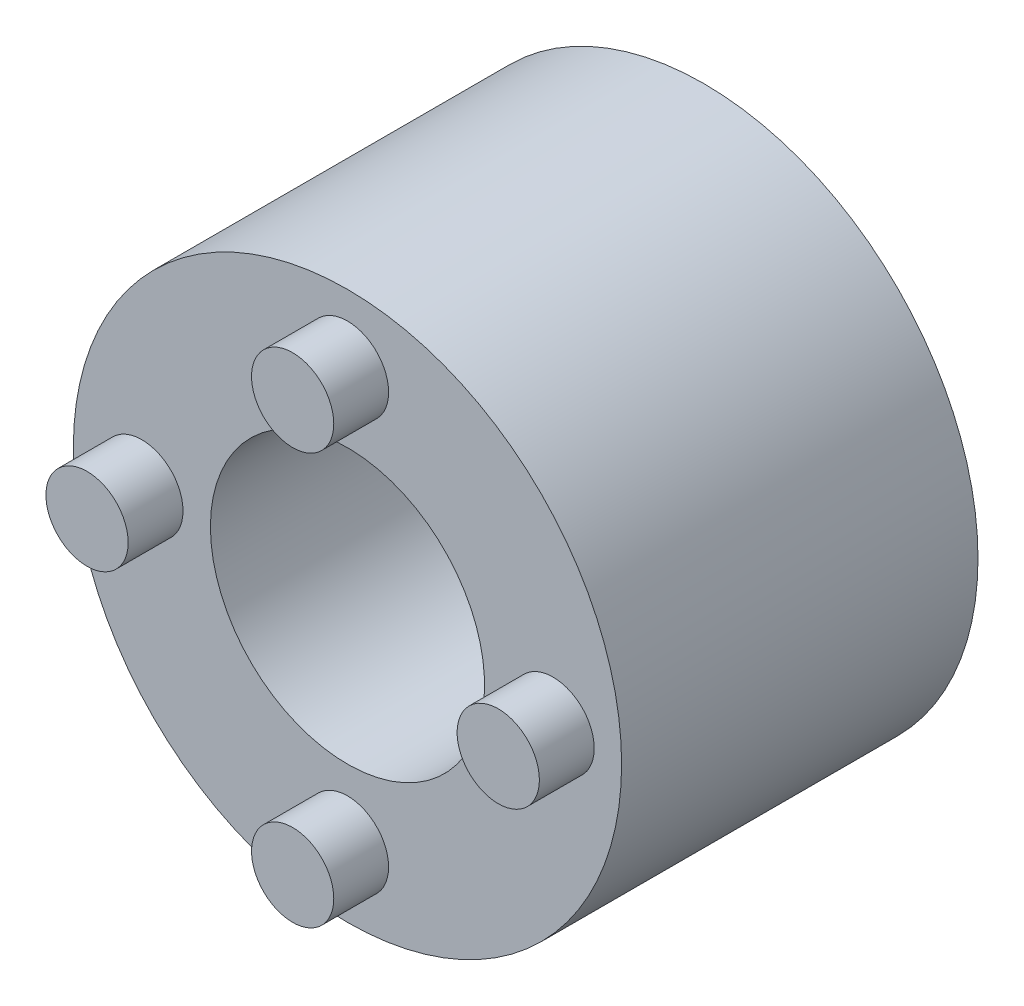
ISO-10303-21;
HEADER;
FILE_DESCRIPTION(('STEP AP214'),'2;1');
FILE_NAME('part.step','',(''),(''),'','','');
FILE_SCHEMA(('AUTOMOTIVE_DESIGN { 1 0 10303 214 1 1 1 1 }'));
ENDSEC;
DATA;
#1=APPLICATION_CONTEXT('core data for automotive mechanical design processes');
#2=APPLICATION_PROTOCOL_DEFINITION('international standard','automotive_design',2000,#1);
#3=PRODUCT_CONTEXT('',#1,'mechanical');
#4=PRODUCT('Part','Part','',(#3));
#5=PRODUCT_RELATED_PRODUCT_CATEGORY('part','',(#4));
#6=PRODUCT_DEFINITION_FORMATION('','',#4);
#7=PRODUCT_DEFINITION_CONTEXT('part definition',#1,'design');
#8=PRODUCT_DEFINITION('design','',#6,#7);
#9=PRODUCT_DEFINITION_SHAPE('','',#8);
#10=(LENGTH_UNIT() NAMED_UNIT(*) SI_UNIT(.MILLI.,.METRE.));
#11=(NAMED_UNIT(*) PLANE_ANGLE_UNIT() SI_UNIT($,.RADIAN.));
#12=(NAMED_UNIT(*) SI_UNIT($,.STERADIAN.) SOLID_ANGLE_UNIT());
#13=UNCERTAINTY_MEASURE_WITH_UNIT(LENGTH_MEASURE(1.E-05),#10,'distance_accuracy_value','');
#14=(GEOMETRIC_REPRESENTATION_CONTEXT(3) GLOBAL_UNCERTAINTY_ASSIGNED_CONTEXT((#13)) GLOBAL_UNIT_ASSIGNED_CONTEXT((#10,
#11,#12)) REPRESENTATION_CONTEXT('',''));
#15=CARTESIAN_POINT('',(0.,0.,0.));
#16=DIRECTION('',(0.,0.,1.));
#17=DIRECTION('',(1.,0.,0.));
#18=AXIS2_PLACEMENT_3D('',#15,#16,#17);
#19=CARTESIAN_POINT('',(0.,0.,6.5));
#20=DIRECTION('',(0.,0.,1.));
#21=DIRECTION('',(1.,0.,0.));
#22=AXIS2_PLACEMENT_3D('',#19,#20,#21);
#23=PLANE('',#22);
#24=CARTESIAN_POINT('',(-7.5,0.,6.5));
#25=DIRECTION('',(0.,0.,1.));
#26=DIRECTION('',(1.,0.,0.));
#27=AXIS2_PLACEMENT_3D('',#24,#25,#26);
#28=CIRCLE('',#27,1.5);
#29=CARTESIAN_POINT('',(-6.,0.,6.5));
#30=VERTEX_POINT('',#29);
#31=EDGE_CURVE('E37',#30,#30,#28,.F.);
#32=ORIENTED_EDGE('',*,*,#31,.T.);
#33=EDGE_LOOP('',(#32));
#34=FACE_BOUND('',#33,.T.);
#35=CARTESIAN_POINT('',(0.,-7.5,6.5));
#36=DIRECTION('',(0.,0.,1.));
#37=DIRECTION('',(1.,0.,0.));
#38=AXIS2_PLACEMENT_3D('',#35,#36,#37);
#39=CIRCLE('',#38,1.5);
#40=CARTESIAN_POINT('',(1.5,-7.5,6.5));
#41=VERTEX_POINT('',#40);
#42=EDGE_CURVE('E59',#41,#41,#39,.F.);
#43=ORIENTED_EDGE('',*,*,#42,.T.);
#44=EDGE_LOOP('',(#43));
#45=FACE_BOUND('',#44,.T.);
#46=CARTESIAN_POINT('',(7.5,0.,6.5));
#47=DIRECTION('',(0.,0.,1.));
#48=DIRECTION('',(1.,0.,0.));
#49=AXIS2_PLACEMENT_3D('',#46,#47,#48);
#50=CIRCLE('',#49,1.5);
#51=CARTESIAN_POINT('',(9.,0.,6.5));
#52=VERTEX_POINT('',#51);
#53=EDGE_CURVE('E56',#52,#52,#50,.F.);
#54=ORIENTED_EDGE('',*,*,#53,.T.);
#55=EDGE_LOOP('',(#54));
#56=FACE_BOUND('',#55,.T.);
#57=CARTESIAN_POINT('',(0.,7.5,6.5));
#58=DIRECTION('',(0.,0.,1.));
#59=DIRECTION('',(1.,0.,0.));
#60=AXIS2_PLACEMENT_3D('',#57,#58,#59);
#61=CIRCLE('',#60,1.5);
#62=CARTESIAN_POINT('',(1.5,7.5,6.5));
#63=VERTEX_POINT('',#62);
#64=EDGE_CURVE('E52',#63,#63,#61,.F.);
#65=ORIENTED_EDGE('',*,*,#64,.T.);
#66=EDGE_LOOP('',(#65));
#67=FACE_BOUND('',#66,.T.);
#68=CARTESIAN_POINT('',(0.,0.,6.5));
#69=DIRECTION('',(0.,0.,1.));
#70=DIRECTION('',(1.,0.,0.));
#71=AXIS2_PLACEMENT_3D('',#68,#69,#70);
#72=CIRCLE('',#71,10.);
#73=CARTESIAN_POINT('',(-10.,0.,6.5));
#74=VERTEX_POINT('',#73);
#75=EDGE_CURVE('E10',#74,#74,#72,.T.);
#76=ORIENTED_EDGE('',*,*,#75,.T.);
#77=EDGE_LOOP('',(#76));
#78=FACE_BOUND('',#77,.T.);
#79=CARTESIAN_POINT('',(0.,0.,6.5));
#80=DIRECTION('',(0.,0.,1.));
#81=DIRECTION('',(1.,0.,0.));
#82=AXIS2_PLACEMENT_3D('',#79,#80,#81);
#83=CIRCLE('',#82,5.);
#84=CARTESIAN_POINT('',(-5.,0.,6.5));
#85=VERTEX_POINT('',#84);
#86=EDGE_CURVE('E46',#85,#85,#83,.T.);
#87=ORIENTED_EDGE('',*,*,#86,.F.);
#88=EDGE_LOOP('',(#87));
#89=FACE_BOUND('',#88,.T.);
#90=ADVANCED_FACE('F33',(#34,#45,#56,#67,#78,#89),#23,.T.);
#91=CARTESIAN_POINT('',(0.,0.,-6.5));
#92=DIRECTION('',(0.,0.,1.));
#93=DIRECTION('',(1.,0.,0.));
#94=AXIS2_PLACEMENT_3D('',#91,#92,#93);
#95=PLANE('',#94);
#96=CARTESIAN_POINT('',(0.,0.,-6.5));
#97=DIRECTION('',(0.,0.,1.));
#98=DIRECTION('',(1.,0.,0.));
#99=AXIS2_PLACEMENT_3D('',#96,#97,#98);
#100=CIRCLE('',#99,10.);
#101=CARTESIAN_POINT('',(-10.,0.,-6.5));
#102=VERTEX_POINT('',#101);
#103=EDGE_CURVE('E41',#102,#102,#100,.T.);
#104=ORIENTED_EDGE('',*,*,#103,.F.);
#105=EDGE_LOOP('',(#104));
#106=FACE_BOUND('',#105,.T.);
#107=CARTESIAN_POINT('',(0.,0.,-6.5));
#108=DIRECTION('',(0.,0.,1.));
#109=DIRECTION('',(1.,0.,0.));
#110=AXIS2_PLACEMENT_3D('',#107,#108,#109);
#111=CIRCLE('',#110,5.);
#112=CARTESIAN_POINT('',(-5.,0.,-6.5));
#113=VERTEX_POINT('',#112);
#114=EDGE_CURVE('E49',#113,#113,#111,.T.);
#115=ORIENTED_EDGE('',*,*,#114,.T.);
#116=EDGE_LOOP('',(#115));
#117=FACE_BOUND('',#116,.T.);
#118=ADVANCED_FACE('F81',(#106,#117),#95,.F.);
#119=CARTESIAN_POINT('',(0.,0.,6.5));
#120=DIRECTION('',(0.,0.,-1.));
#121=DIRECTION('',(-1.,0.,0.));
#122=AXIS2_PLACEMENT_3D('',#119,#120,#121);
#123=CYLINDRICAL_SURFACE('',#122,10.);
#124=CARTESIAN_POINT('',(-10.,0.,6.5));
#125=CARTESIAN_POINT('',(-10.,0.,6.36458333333333));
#126=CARTESIAN_POINT('',(-10.,0.,6.22916666666667));
#127=CARTESIAN_POINT('',(-10.,0.,5.95833333333333));
#128=CARTESIAN_POINT('',(-10.,0.,5.82291666666667));
#129=CARTESIAN_POINT('',(-10.,0.,5.55208333333333));
#130=CARTESIAN_POINT('',(-10.,0.,5.41666666666667));
#131=CARTESIAN_POINT('',(-10.,0.,5.14583333333333));
#132=CARTESIAN_POINT('',(-10.,0.,5.01041666666667));
#133=CARTESIAN_POINT('',(-10.,0.,4.73958333333333));
#134=CARTESIAN_POINT('',(-10.,0.,4.60416666666667));
#135=CARTESIAN_POINT('',(-10.,0.,4.33333333333333));
#136=CARTESIAN_POINT('',(-10.,0.,4.19791666666667));
#137=CARTESIAN_POINT('',(-10.,0.,3.92708333333333));
#138=CARTESIAN_POINT('',(-10.,0.,3.79166666666667));
#139=CARTESIAN_POINT('',(-10.,0.,3.52083333333333));
#140=CARTESIAN_POINT('',(-10.,0.,3.38541666666667));
#141=CARTESIAN_POINT('',(-10.,0.,3.11458333333333));
#142=CARTESIAN_POINT('',(-10.,0.,2.97916666666667));
#143=CARTESIAN_POINT('',(-10.,0.,2.70833333333333));
#144=CARTESIAN_POINT('',(-10.,0.,2.57291666666667));
#145=CARTESIAN_POINT('',(-10.,0.,2.30208333333333));
#146=CARTESIAN_POINT('',(-10.,0.,2.16666666666667));
#147=CARTESIAN_POINT('',(-10.,0.,1.89583333333333));
#148=CARTESIAN_POINT('',(-10.,0.,1.76041666666667));
#149=CARTESIAN_POINT('',(-10.,0.,1.48958333333333));
#150=CARTESIAN_POINT('',(-10.,0.,1.35416666666667));
#151=CARTESIAN_POINT('',(-10.,0.,1.08333333333333));
#152=CARTESIAN_POINT('',(-10.,0.,0.947916666666666));
#153=CARTESIAN_POINT('',(-10.,0.,0.677083333333332));
#154=CARTESIAN_POINT('',(-10.,0.,0.541666666666666));
#155=CARTESIAN_POINT('',(-10.,0.,0.270833333333333));
#156=CARTESIAN_POINT('',(-10.,0.,0.135416666666666));
#157=CARTESIAN_POINT('',(-10.,0.,-0.135416666666668));
#158=CARTESIAN_POINT('',(-10.,0.,-0.270833333333334));
#159=CARTESIAN_POINT('',(-10.,0.,-0.541666666666668));
#160=CARTESIAN_POINT('',(-10.,0.,-0.677083333333334));
#161=CARTESIAN_POINT('',(-10.,0.,-0.947916666666667));
#162=CARTESIAN_POINT('',(-10.,0.,-1.08333333333333));
#163=CARTESIAN_POINT('',(-10.,0.,-1.35416666666667));
#164=CARTESIAN_POINT('',(-10.,0.,-1.48958333333333));
#165=CARTESIAN_POINT('',(-10.,0.,-1.76041666666667));
#166=CARTESIAN_POINT('',(-10.,0.,-1.89583333333333));
#167=CARTESIAN_POINT('',(-10.,0.,-2.16666666666667));
#168=CARTESIAN_POINT('',(-10.,0.,-2.30208333333333));
#169=CARTESIAN_POINT('',(-10.,0.,-2.57291666666667));
#170=CARTESIAN_POINT('',(-10.,0.,-2.70833333333333));
#171=CARTESIAN_POINT('',(-10.,0.,-2.97916666666667));
#172=CARTESIAN_POINT('',(-10.,0.,-3.11458333333333));
#173=CARTESIAN_POINT('',(-10.,0.,-3.38541666666667));
#174=CARTESIAN_POINT('',(-10.,0.,-3.52083333333333));
#175=CARTESIAN_POINT('',(-10.,0.,-3.79166666666667));
#176=CARTESIAN_POINT('',(-10.,0.,-3.92708333333333));
#177=CARTESIAN_POINT('',(-10.,0.,-4.19791666666667));
#178=CARTESIAN_POINT('',(-10.,0.,-4.33333333333333));
#179=CARTESIAN_POINT('',(-10.,0.,-4.60416666666667));
#180=CARTESIAN_POINT('',(-10.,0.,-4.73958333333333));
#181=CARTESIAN_POINT('',(-10.,0.,-5.01041666666667));
#182=CARTESIAN_POINT('',(-10.,0.,-5.14583333333333));
#183=CARTESIAN_POINT('',(-10.,0.,-5.41666666666667));
#184=CARTESIAN_POINT('',(-10.,0.,-5.55208333333333));
#185=CARTESIAN_POINT('',(-10.,0.,-5.82291666666667));
#186=CARTESIAN_POINT('',(-10.,0.,-5.95833333333333));
#187=CARTESIAN_POINT('',(-10.,0.,-6.22916666666667));
#188=CARTESIAN_POINT('',(-10.,0.,-6.36458333333333));
#189=CARTESIAN_POINT('',(-10.,0.,-6.5));
#190=B_SPLINE_CURVE_WITH_KNOTS('',3,(#124,#125,#126,#127,#128,#129,#130,#131,#132,#133,#134,
#135,#136,#137,#138,#139,#140,#141,#142,#143,#144,#145,#146,#147,#148,#149,#150,#151,#152,#153,
#154,#155,#156,#157,#158,#159,#160,#161,#162,#163,#164,#165,#166,#167,#168,#169,#170,#171,#172,
#173,#174,#175,#176,#177,#178,#179,#180,#181,#182,#183,#184,#185,#186,#187,#188,#189),
.UNSPECIFIED.,.F.,.F.,(4,2,2,2,2,2,2,2,2,2,2,2,2,2,2,2,2,2,2,2,2,2,2,2,2,2,2,2,2,2,2,2,4),(0.,
0.40625,0.8125,1.21875,1.625,2.03125,2.4375,2.84375,3.25,3.65625,4.0625,4.46875,4.875,5.28125,
5.6875,6.09375,6.5,6.90625,7.3125,7.71875,8.125,8.53125,8.9375,9.34375,9.75,10.15625,10.5625,
10.96875,11.375,11.78125,12.1875,12.59375,13.),.UNSPECIFIED.);
#191=EDGE_CURVE('BSEAM35',#74,#102,#190,.T.);
#192=ORIENTED_EDGE('',*,*,#75,.F.);
#193=ORIENTED_EDGE('',*,*,#103,.T.);
#194=ORIENTED_EDGE('',*,*,#191,.T.);
#195=ORIENTED_EDGE('',*,*,#191,.F.);
#196=EDGE_LOOP('',(#192,#194,#193,#195));
#197=FACE_BOUND('',#196,.T.);
#198=ADVANCED_FACE('F35',(#197),#123,.T.);
#199=CARTESIAN_POINT('',(0.,0.,6.5));
#200=DIRECTION('',(0.,0.,-1.));
#201=DIRECTION('',(-1.,0.,0.));
#202=AXIS2_PLACEMENT_3D('',#199,#200,#201);
#203=CYLINDRICAL_SURFACE('',#202,5.);
#204=CARTESIAN_POINT('',(-5.,0.,6.5));
#205=CARTESIAN_POINT('',(-5.,0.,6.36458333333333));
#206=CARTESIAN_POINT('',(-5.,0.,6.22916666666667));
#207=CARTESIAN_POINT('',(-5.,0.,5.95833333333333));
#208=CARTESIAN_POINT('',(-5.,0.,5.82291666666667));
#209=CARTESIAN_POINT('',(-5.,0.,5.55208333333333));
#210=CARTESIAN_POINT('',(-5.,0.,5.41666666666667));
#211=CARTESIAN_POINT('',(-5.,0.,5.14583333333333));
#212=CARTESIAN_POINT('',(-5.,0.,5.01041666666667));
#213=CARTESIAN_POINT('',(-5.,0.,4.73958333333333));
#214=CARTESIAN_POINT('',(-5.,0.,4.60416666666667));
#215=CARTESIAN_POINT('',(-5.,0.,4.33333333333333));
#216=CARTESIAN_POINT('',(-5.,0.,4.19791666666667));
#217=CARTESIAN_POINT('',(-5.,0.,3.92708333333333));
#218=CARTESIAN_POINT('',(-5.,0.,3.79166666666667));
#219=CARTESIAN_POINT('',(-5.,0.,3.52083333333333));
#220=CARTESIAN_POINT('',(-5.,0.,3.38541666666667));
#221=CARTESIAN_POINT('',(-5.,0.,3.11458333333333));
#222=CARTESIAN_POINT('',(-5.,0.,2.97916666666667));
#223=CARTESIAN_POINT('',(-5.,0.,2.70833333333333));
#224=CARTESIAN_POINT('',(-5.,0.,2.57291666666667));
#225=CARTESIAN_POINT('',(-5.,0.,2.30208333333333));
#226=CARTESIAN_POINT('',(-5.,0.,2.16666666666667));
#227=CARTESIAN_POINT('',(-5.,0.,1.89583333333333));
#228=CARTESIAN_POINT('',(-5.,0.,1.76041666666667));
#229=CARTESIAN_POINT('',(-5.,0.,1.48958333333333));
#230=CARTESIAN_POINT('',(-5.,0.,1.35416666666667));
#231=CARTESIAN_POINT('',(-5.,0.,1.08333333333333));
#232=CARTESIAN_POINT('',(-5.,0.,0.947916666666666));
#233=CARTESIAN_POINT('',(-5.,0.,0.677083333333332));
#234=CARTESIAN_POINT('',(-5.,0.,0.541666666666666));
#235=CARTESIAN_POINT('',(-5.,0.,0.270833333333333));
#236=CARTESIAN_POINT('',(-5.,0.,0.135416666666666));
#237=CARTESIAN_POINT('',(-5.,0.,-0.135416666666668));
#238=CARTESIAN_POINT('',(-5.,0.,-0.270833333333334));
#239=CARTESIAN_POINT('',(-5.,0.,-0.541666666666668));
#240=CARTESIAN_POINT('',(-5.,0.,-0.677083333333334));
#241=CARTESIAN_POINT('',(-5.,0.,-0.947916666666667));
#242=CARTESIAN_POINT('',(-5.,0.,-1.08333333333333));
#243=CARTESIAN_POINT('',(-5.,0.,-1.35416666666667));
#244=CARTESIAN_POINT('',(-5.,0.,-1.48958333333333));
#245=CARTESIAN_POINT('',(-5.,0.,-1.76041666666667));
#246=CARTESIAN_POINT('',(-5.,0.,-1.89583333333333));
#247=CARTESIAN_POINT('',(-5.,0.,-2.16666666666667));
#248=CARTESIAN_POINT('',(-5.,0.,-2.30208333333333));
#249=CARTESIAN_POINT('',(-5.,0.,-2.57291666666667));
#250=CARTESIAN_POINT('',(-5.,0.,-2.70833333333333));
#251=CARTESIAN_POINT('',(-5.,0.,-2.97916666666667));
#252=CARTESIAN_POINT('',(-5.,0.,-3.11458333333333));
#253=CARTESIAN_POINT('',(-5.,0.,-3.38541666666667));
#254=CARTESIAN_POINT('',(-5.,0.,-3.52083333333333));
#255=CARTESIAN_POINT('',(-5.,0.,-3.79166666666667));
#256=CARTESIAN_POINT('',(-5.,0.,-3.92708333333333));
#257=CARTESIAN_POINT('',(-5.,0.,-4.19791666666667));
#258=CARTESIAN_POINT('',(-5.,0.,-4.33333333333333));
#259=CARTESIAN_POINT('',(-5.,0.,-4.60416666666667));
#260=CARTESIAN_POINT('',(-5.,0.,-4.73958333333333));
#261=CARTESIAN_POINT('',(-5.,0.,-5.01041666666667));
#262=CARTESIAN_POINT('',(-5.,0.,-5.14583333333333));
#263=CARTESIAN_POINT('',(-5.,0.,-5.41666666666667));
#264=CARTESIAN_POINT('',(-5.,0.,-5.55208333333333));
#265=CARTESIAN_POINT('',(-5.,0.,-5.82291666666667));
#266=CARTESIAN_POINT('',(-5.,0.,-5.95833333333333));
#267=CARTESIAN_POINT('',(-5.,0.,-6.22916666666667));
#268=CARTESIAN_POINT('',(-5.,0.,-6.36458333333333));
#269=CARTESIAN_POINT('',(-5.,0.,-6.5));
#270=B_SPLINE_CURVE_WITH_KNOTS('',3,(#204,#205,#206,#207,#208,#209,#210,#211,#212,#213,#214,
#215,#216,#217,#218,#219,#220,#221,#222,#223,#224,#225,#226,#227,#228,#229,#230,#231,#232,#233,
#234,#235,#236,#237,#238,#239,#240,#241,#242,#243,#244,#245,#246,#247,#248,#249,#250,#251,#252,
#253,#254,#255,#256,#257,#258,#259,#260,#261,#262,#263,#264,#265,#266,#267,#268,#269),
.UNSPECIFIED.,.F.,.F.,(4,2,2,2,2,2,2,2,2,2,2,2,2,2,2,2,2,2,2,2,2,2,2,2,2,2,2,2,2,2,2,2,4),(0.,
0.40625,0.8125,1.21875,1.625,2.03125,2.4375,2.84375,3.25,3.65625,4.0625,4.46875,4.875,5.28125,
5.6875,6.09375,6.5,6.90625,7.3125,7.71875,8.125,8.53125,8.9375,9.34375,9.75,10.15625,10.5625,
10.96875,11.375,11.78125,12.1875,12.59375,13.),.UNSPECIFIED.);
#271=EDGE_CURVE('BSEAM83',#85,#113,#270,.T.);
#272=ORIENTED_EDGE('',*,*,#86,.T.);
#273=ORIENTED_EDGE('',*,*,#114,.F.);
#274=ORIENTED_EDGE('',*,*,#271,.T.);
#275=ORIENTED_EDGE('',*,*,#271,.F.);
#276=EDGE_LOOP('',(#272,#274,#273,#275));
#277=FACE_BOUND('',#276,.T.);
#278=ADVANCED_FACE('F83',(#277),#203,.F.);
#279=CARTESIAN_POINT('',(0.,7.5,8.5));
#280=DIRECTION('',(0.,0.,-1.));
#281=DIRECTION('',(-1.,0.,0.));
#282=AXIS2_PLACEMENT_3D('',#279,#280,#281);
#283=CYLINDRICAL_SURFACE('',#282,1.5);
#284=ORIENTED_EDGE('',*,*,#64,.F.);
#285=EDGE_LOOP('',(#284));
#286=FACE_BOUND('',#285,.T.);
#287=CARTESIAN_POINT('',(0.,7.5,8.5));
#288=DIRECTION('',(0.,0.,1.));
#289=DIRECTION('',(1.,0.,0.));
#290=AXIS2_PLACEMENT_3D('',#287,#288,#289);
#291=CIRCLE('',#290,1.5);
#292=CARTESIAN_POINT('',(1.5,7.5,8.5));
#293=VERTEX_POINT('',#292);
#294=EDGE_CURVE('E55',#293,#293,#291,.T.);
#295=ORIENTED_EDGE('',*,*,#294,.F.);
#296=EDGE_LOOP('',(#295));
#297=FACE_BOUND('',#296,.T.);
#298=ADVANCED_FACE('F85',(#286,#297),#283,.T.);
#299=CARTESIAN_POINT('',(0.,7.5,8.5));
#300=DIRECTION('',(0.,0.,1.));
#301=DIRECTION('',(1.,0.,0.));
#302=AXIS2_PLACEMENT_3D('',#299,#300,#301);
#303=PLANE('',#302);
#304=ORIENTED_EDGE('',*,*,#294,.T.);
#305=EDGE_LOOP('',(#304));
#306=FACE_BOUND('',#305,.T.);
#307=ADVANCED_FACE('F91',(#306),#303,.T.);
#308=CARTESIAN_POINT('',(7.5,0.,8.5));
#309=DIRECTION('',(0.,0.,-1.));
#310=DIRECTION('',(-1.,0.,0.));
#311=AXIS2_PLACEMENT_3D('',#308,#309,#310);
#312=CYLINDRICAL_SURFACE('',#311,1.5);
#313=ORIENTED_EDGE('',*,*,#53,.F.);
#314=EDGE_LOOP('',(#313));
#315=FACE_BOUND('',#314,.T.);
#316=CARTESIAN_POINT('',(7.5,0.,8.5));
#317=DIRECTION('',(0.,0.,1.));
#318=DIRECTION('',(1.,0.,0.));
#319=AXIS2_PLACEMENT_3D('',#316,#317,#318);
#320=CIRCLE('',#319,1.5);
#321=CARTESIAN_POINT('',(9.,0.,8.5));
#322=VERTEX_POINT('',#321);
#323=EDGE_CURVE('E58',#322,#322,#320,.T.);
#324=ORIENTED_EDGE('',*,*,#323,.F.);
#325=EDGE_LOOP('',(#324));
#326=FACE_BOUND('',#325,.T.);
#327=ADVANCED_FACE('F112',(#315,#326),#312,.T.);
#328=CARTESIAN_POINT('',(7.5,0.,8.5));
#329=DIRECTION('',(0.,0.,1.));
#330=DIRECTION('',(1.,0.,0.));
#331=AXIS2_PLACEMENT_3D('',#328,#329,#330);
#332=PLANE('',#331);
#333=ORIENTED_EDGE('',*,*,#323,.T.);
#334=EDGE_LOOP('',(#333));
#335=FACE_BOUND('',#334,.T.);
#336=ADVANCED_FACE('F117',(#335),#332,.T.);
#337=CARTESIAN_POINT('',(0.,-7.5,8.5));
#338=DIRECTION('',(0.,0.,-1.));
#339=DIRECTION('',(-1.,0.,0.));
#340=AXIS2_PLACEMENT_3D('',#337,#338,#339);
#341=CYLINDRICAL_SURFACE('',#340,1.5);
#342=ORIENTED_EDGE('',*,*,#42,.F.);
#343=EDGE_LOOP('',(#342));
#344=FACE_BOUND('',#343,.T.);
#345=CARTESIAN_POINT('',(0.,-7.5,8.5));
#346=DIRECTION('',(0.,0.,1.));
#347=DIRECTION('',(1.,0.,0.));
#348=AXIS2_PLACEMENT_3D('',#345,#346,#347);
#349=CIRCLE('',#348,1.5);
#350=CARTESIAN_POINT('',(1.5,-7.5,8.5));
#351=VERTEX_POINT('',#350);
#352=EDGE_CURVE('E61',#351,#351,#349,.T.);
#353=ORIENTED_EDGE('',*,*,#352,.F.);
#354=EDGE_LOOP('',(#353));
#355=FACE_BOUND('',#354,.T.);
#356=ADVANCED_FACE('F123',(#344,#355),#341,.T.);
#357=CARTESIAN_POINT('',(0.,-7.5,8.5));
#358=DIRECTION('',(0.,0.,1.));
#359=DIRECTION('',(1.,0.,0.));
#360=AXIS2_PLACEMENT_3D('',#357,#358,#359);
#361=PLANE('',#360);
#362=ORIENTED_EDGE('',*,*,#352,.T.);
#363=EDGE_LOOP('',(#362));
#364=FACE_BOUND('',#363,.T.);
#365=ADVANCED_FACE('F127',(#364),#361,.T.);
#366=CARTESIAN_POINT('',(-7.5,0.,8.5));
#367=DIRECTION('',(0.,0.,-1.));
#368=DIRECTION('',(-1.,0.,0.));
#369=AXIS2_PLACEMENT_3D('',#366,#367,#368);
#370=CYLINDRICAL_SURFACE('',#369,1.5);
#371=ORIENTED_EDGE('',*,*,#31,.F.);
#372=EDGE_LOOP('',(#371));
#373=FACE_BOUND('',#372,.T.);
#374=CARTESIAN_POINT('',(-7.5,0.,8.5));
#375=DIRECTION('',(0.,0.,1.));
#376=DIRECTION('',(1.,0.,0.));
#377=AXIS2_PLACEMENT_3D('',#374,#375,#376);
#378=CIRCLE('',#377,1.5);
#379=CARTESIAN_POINT('',(-6.,0.,8.5));
#380=VERTEX_POINT('',#379);
#381=EDGE_CURVE('E71',#380,#380,#378,.T.);
#382=ORIENTED_EDGE('',*,*,#381,.F.);
#383=EDGE_LOOP('',(#382));
#384=FACE_BOUND('',#383,.T.);
#385=ADVANCED_FACE('F131',(#373,#384),#370,.T.);
#386=CARTESIAN_POINT('',(-7.5,0.,8.5));
#387=DIRECTION('',(0.,0.,1.));
#388=DIRECTION('',(1.,0.,0.));
#389=AXIS2_PLACEMENT_3D('',#386,#387,#388);
#390=PLANE('',#389);
#391=ORIENTED_EDGE('',*,*,#381,.T.);
#392=EDGE_LOOP('',(#391));
#393=FACE_BOUND('',#392,.T.);
#394=ADVANCED_FACE('F134',(#393),#390,.T.);
#395=CLOSED_SHELL('',(#90,#118,#198,#278,#298,#307,#327,#336,#356,#365,#385,#394));
#396=MANIFOLD_SOLID_BREP('B2',#395);
#397=ADVANCED_BREP_SHAPE_REPRESENTATION('',(#18,#396),#14);
#398=SHAPE_DEFINITION_REPRESENTATION(#9,#397);
ENDSEC;
END-ISO-10303-21;
